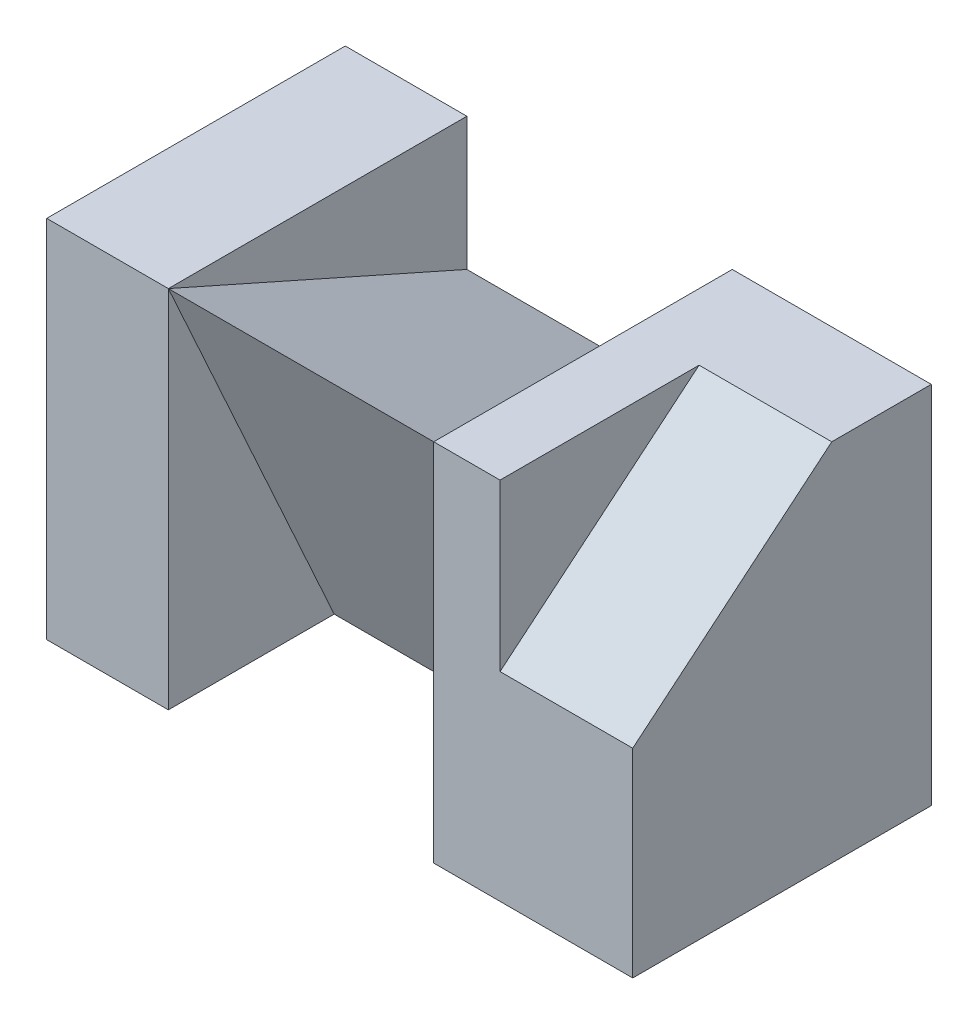
ISO-10303-21;
HEADER;
FILE_DESCRIPTION(('STEP AP214'),'2;1');
FILE_NAME('part.step','',(''),(''),'','','');
FILE_SCHEMA(('AUTOMOTIVE_DESIGN { 1 0 10303 214 1 1 1 1 }'));
ENDSEC;
DATA;
#1=APPLICATION_CONTEXT('core data for automotive mechanical design processes');
#2=APPLICATION_PROTOCOL_DEFINITION('international standard','automotive_design',2000,#1);
#3=PRODUCT_CONTEXT('',#1,'mechanical');
#4=PRODUCT('Part','Part','',(#3));
#5=PRODUCT_RELATED_PRODUCT_CATEGORY('part','',(#4));
#6=PRODUCT_DEFINITION_FORMATION('','',#4);
#7=PRODUCT_DEFINITION_CONTEXT('part definition',#1,'design');
#8=PRODUCT_DEFINITION('design','',#6,#7);
#9=PRODUCT_DEFINITION_SHAPE('','',#8);
#10=(LENGTH_UNIT() NAMED_UNIT(*) SI_UNIT(.MILLI.,.METRE.));
#11=(NAMED_UNIT(*) PLANE_ANGLE_UNIT() SI_UNIT($,.RADIAN.));
#12=(NAMED_UNIT(*) SI_UNIT($,.STERADIAN.) SOLID_ANGLE_UNIT());
#13=UNCERTAINTY_MEASURE_WITH_UNIT(LENGTH_MEASURE(1.E-05),#10,'distance_accuracy_value','');
#14=(GEOMETRIC_REPRESENTATION_CONTEXT(3) GLOBAL_UNCERTAINTY_ASSIGNED_CONTEXT((#13)) GLOBAL_UNIT_ASSIGNED_CONTEXT((#10,
#11,#12)) REPRESENTATION_CONTEXT('',''));
#15=CARTESIAN_POINT('',(0.,0.,0.));
#16=DIRECTION('',(0.,0.,1.));
#17=DIRECTION('',(1.,0.,0.));
#18=AXIS2_PLACEMENT_3D('',#15,#16,#17);
#19=CARTESIAN_POINT('',(0.,33.,-13.5));
#20=DIRECTION('',(0.,0.,-1.));
#21=DIRECTION('',(-1.,0.,0.));
#22=AXIS2_PLACEMENT_3D('',#19,#20,#21);
#23=PLANE('',#22);
#24=DIRECTION('',(1.,0.,0.));
#25=VECTOR('',#24,1.);
#26=CARTESIAN_POINT('',(0.,33.,-13.5));
#27=LINE('',#26,#25);
#28=CARTESIAN_POINT('',(-11.,33.,-13.5));
#29=VERTEX_POINT('',#28);
#30=CARTESIAN_POINT('',(0.,33.,-13.5));
#31=VERTEX_POINT('',#30);
#32=EDGE_CURVE('E179',#29,#31,#27,.T.);
#33=ORIENTED_EDGE('',*,*,#32,.T.);
#34=DIRECTION('',(0.,-1.,0.));
#35=VECTOR('',#34,1.);
#36=CARTESIAN_POINT('',(0.,33.,-13.5));
#37=LINE('',#36,#35);
#38=CARTESIAN_POINT('',(0.,21.,-13.5));
#39=VERTEX_POINT('',#38);
#40=EDGE_CURVE('E261',#31,#39,#37,.T.);
#41=ORIENTED_EDGE('',*,*,#40,.T.);
#42=DIRECTION('',(1.,0.,0.));
#43=VECTOR('',#42,1.);
#44=CARTESIAN_POINT('',(0.,21.,-13.5));
#45=LINE('',#44,#43);
#46=CARTESIAN_POINT('',(24.,21.,-13.5));
#47=VERTEX_POINT('',#46);
#48=EDGE_CURVE('E257',#39,#47,#45,.T.);
#49=ORIENTED_EDGE('',*,*,#48,.T.);
#50=DIRECTION('',(0.,-1.,0.));
#51=VECTOR('',#50,1.);
#52=CARTESIAN_POINT('',(24.,33.,-13.5));
#53=LINE('',#52,#51);
#54=CARTESIAN_POINT('',(24.,33.,-13.5));
#55=VERTEX_POINT('',#54);
#56=EDGE_CURVE('E253',#55,#47,#53,.T.);
#57=ORIENTED_EDGE('',*,*,#56,.F.);
#58=CARTESIAN_POINT('',(42.,33.,-13.5));
#59=VERTEX_POINT('',#58);
#60=EDGE_CURVE('E185',#55,#59,#27,.T.);
#61=ORIENTED_EDGE('',*,*,#60,.T.);
#62=DIRECTION('',(0.,-1.,0.));
#63=VECTOR('',#62,1.);
#64=CARTESIAN_POINT('',(42.,33.,-13.5));
#65=LINE('',#64,#63);
#66=CARTESIAN_POINT('',(42.,0.,-13.5));
#67=VERTEX_POINT('',#66);
#68=EDGE_CURVE('E12',#59,#67,#65,.T.);
#69=ORIENTED_EDGE('',*,*,#68,.T.);
#70=DIRECTION('',(1.,0.,0.));
#71=VECTOR('',#70,1.);
#72=CARTESIAN_POINT('',(0.,0.,-13.5));
#73=LINE('',#72,#71);
#74=CARTESIAN_POINT('',(-24.,0.,-13.5));
#75=VERTEX_POINT('',#74);
#76=EDGE_CURVE('E193',#75,#67,#73,.T.);
#77=ORIENTED_EDGE('',*,*,#76,.F.);
#78=DIRECTION('',(0.,-1.,0.));
#79=VECTOR('',#78,1.);
#80=CARTESIAN_POINT('',(-24.,13.,-13.5));
#81=LINE('',#80,#79);
#82=CARTESIAN_POINT('',(-24.,13.,-13.5));
#83=VERTEX_POINT('',#82);
#84=EDGE_CURVE('E222',#83,#75,#81,.T.);
#85=ORIENTED_EDGE('',*,*,#84,.F.);
#86=DIRECTION('',(1.,0.,0.));
#87=VECTOR('',#86,1.);
#88=CARTESIAN_POINT('',(0.,13.,-13.5));
#89=LINE('',#88,#87);
#90=CARTESIAN_POINT('',(-11.,13.,-13.5));
#91=VERTEX_POINT('',#90);
#92=EDGE_CURVE('E311',#83,#91,#89,.T.);
#93=ORIENTED_EDGE('',*,*,#92,.T.);
#94=DIRECTION('',(0.,-1.,0.));
#95=VECTOR('',#94,1.);
#96=CARTESIAN_POINT('',(-11.,33.,-13.5));
#97=LINE('',#96,#95);
#98=EDGE_CURVE('E194',#29,#91,#97,.T.);
#99=ORIENTED_EDGE('',*,*,#98,.F.);
#100=EDGE_LOOP('',(#33,#41,#49,#57,#61,#69,#77,#85,#93,#99));
#101=FACE_BOUND('',#100,.T.);
#102=ADVANCED_FACE('F62',(#101),#23,.T.);
#103=CARTESIAN_POINT('',(0.,33.,0.));
#104=DIRECTION('',(0.,1.,0.));
#105=DIRECTION('',(0.,0.,1.));
#106=AXIS2_PLACEMENT_3D('',#103,#104,#105);
#107=PLANE('',#106);
#108=DIRECTION('',(1.,0.,0.));
#109=VECTOR('',#108,1.);
#110=CARTESIAN_POINT('',(0.,33.,13.5));
#111=LINE('',#110,#109);
#112=CARTESIAN_POINT('',(-11.,33.,13.5));
#113=VERTEX_POINT('',#112);
#114=CARTESIAN_POINT('',(0.,33.,13.5));
#115=VERTEX_POINT('',#114);
#116=EDGE_CURVE('E178',#113,#115,#111,.T.);
#117=ORIENTED_EDGE('',*,*,#116,.T.);
#118=DIRECTION('',(0.,0.,-1.));
#119=VECTOR('',#118,1.);
#120=CARTESIAN_POINT('',(0.,33.,13.5));
#121=LINE('',#120,#119);
#122=EDGE_CURVE('E278',#115,#31,#121,.T.);
#123=ORIENTED_EDGE('',*,*,#122,.T.);
#124=ORIENTED_EDGE('',*,*,#32,.F.);
#125=DIRECTION('',(0.,0.,1.));
#126=VECTOR('',#125,1.);
#127=CARTESIAN_POINT('',(-11.,33.,0.));
#128=LINE('',#127,#126);
#129=EDGE_CURVE('E231',#29,#113,#128,.T.);
#130=ORIENTED_EDGE('',*,*,#129,.T.);
#131=EDGE_LOOP('',(#117,#123,#124,#130));
#132=FACE_BOUND('',#131,.T.);
#133=ADVANCED_FACE('F329',(#132),#107,.T.);
#134=CARTESIAN_POINT('',(0.,33.,13.5));
#135=DIRECTION('',(0.,0.,-1.));
#136=DIRECTION('',(-1.,0.,0.));
#137=AXIS2_PLACEMENT_3D('',#134,#135,#136);
#138=PLANE('',#137);
#139=DIRECTION('',(0.,-1.,0.));
#140=VECTOR('',#139,1.);
#141=CARTESIAN_POINT('',(42.,33.,13.5));
#142=LINE('',#141,#140);
#143=CARTESIAN_POINT('',(42.,18.,13.5));
#144=VERTEX_POINT('',#143);
#145=CARTESIAN_POINT('',(42.,0.,13.5));
#146=VERTEX_POINT('',#145);
#147=EDGE_CURVE('E71',#144,#146,#142,.T.);
#148=ORIENTED_EDGE('',*,*,#147,.F.);
#149=DIRECTION('',(1.,0.,0.));
#150=VECTOR('',#149,1.);
#151=CARTESIAN_POINT('',(30.,18.,13.5));
#152=LINE('',#151,#150);
#153=CARTESIAN_POINT('',(30.,18.,13.5));
#154=VERTEX_POINT('',#153);
#155=EDGE_CURVE('E170',#154,#144,#152,.T.);
#156=ORIENTED_EDGE('',*,*,#155,.F.);
#157=DIRECTION('',(0.,-1.,0.));
#158=VECTOR('',#157,1.);
#159=CARTESIAN_POINT('',(30.,18.,13.5));
#160=LINE('',#159,#158);
#161=CARTESIAN_POINT('',(30.,33.,13.5));
#162=VERTEX_POINT('',#161);
#163=EDGE_CURVE('E156',#162,#154,#160,.T.);
#164=ORIENTED_EDGE('',*,*,#163,.F.);
#165=CARTESIAN_POINT('',(24.,33.,13.5));
#166=VERTEX_POINT('',#165);
#167=EDGE_CURVE('E169',#166,#162,#111,.T.);
#168=ORIENTED_EDGE('',*,*,#167,.F.);
#169=DIRECTION('',(0.,1.,0.));
#170=VECTOR('',#169,1.);
#171=CARTESIAN_POINT('',(24.,0.,13.5));
#172=LINE('',#171,#170);
#173=CARTESIAN_POINT('',(24.,0.,13.5));
#174=VERTEX_POINT('',#173);
#175=EDGE_CURVE('E211',#174,#166,#172,.T.);
#176=ORIENTED_EDGE('',*,*,#175,.F.);
#177=DIRECTION('',(1.,0.,0.));
#178=VECTOR('',#177,1.);
#179=CARTESIAN_POINT('',(0.,0.,13.5));
#180=LINE('',#179,#178);
#181=EDGE_CURVE('E198',#174,#146,#180,.T.);
#182=ORIENTED_EDGE('',*,*,#181,.T.);
#183=EDGE_LOOP('',(#148,#156,#164,#168,#176,#182));
#184=FACE_BOUND('',#183,.T.);
#185=ADVANCED_FACE('F167',(#184),#138,.F.);
#186=CARTESIAN_POINT('',(42.,33.,0.));
#187=DIRECTION('',(1.,0.,0.));
#188=DIRECTION('',(0.,0.,-1.));
#189=AXIS2_PLACEMENT_3D('',#186,#187,#188);
#190=PLANE('',#189);
#191=DIRECTION('',(0.,0.64018439966448,-0.768221279597376));
#192=VECTOR('',#191,1.);
#193=CARTESIAN_POINT('',(42.,33.,-4.5));
#194=LINE('',#193,#192);
#195=CARTESIAN_POINT('',(42.,33.,-4.5));
#196=VERTEX_POINT('',#195);
#197=EDGE_CURVE('E161',#144,#196,#194,.T.);
#198=ORIENTED_EDGE('',*,*,#197,.F.);
#199=ORIENTED_EDGE('',*,*,#147,.T.);
#200=DIRECTION('',(0.,0.,1.));
#201=VECTOR('',#200,1.);
#202=CARTESIAN_POINT('',(42.,0.,0.));
#203=LINE('',#202,#201);
#204=EDGE_CURVE('E189',#67,#146,#203,.T.);
#205=ORIENTED_EDGE('',*,*,#204,.F.);
#206=ORIENTED_EDGE('',*,*,#68,.F.);
#207=DIRECTION('',(0.,0.,1.));
#208=VECTOR('',#207,1.);
#209=CARTESIAN_POINT('',(42.,33.,0.));
#210=LINE('',#209,#208);
#211=EDGE_CURVE('E202',#59,#196,#210,.T.);
#212=ORIENTED_EDGE('',*,*,#211,.T.);
#213=EDGE_LOOP('',(#198,#199,#205,#206,#212));
#214=FACE_BOUND('',#213,.T.);
#215=ADVANCED_FACE('F64',(#214),#190,.T.);
#216=CARTESIAN_POINT('',(-11.,0.,13.5));
#217=VERTEX_POINT('',#216);
#218=CARTESIAN_POINT('',(0.,0.,13.5));
#219=VERTEX_POINT('',#218);
#220=EDGE_CURVE('E199',#217,#219,#180,.T.);
#221=ORIENTED_EDGE('',*,*,#220,.T.);
#222=DIRECTION('',(0.,1.,0.));
#223=VECTOR('',#222,1.);
#224=CARTESIAN_POINT('',(0.,0.,13.5));
#225=LINE('',#224,#223);
#226=EDGE_CURVE('E290',#219,#115,#225,.T.);
#227=ORIENTED_EDGE('',*,*,#226,.T.);
#228=ORIENTED_EDGE('',*,*,#116,.F.);
#229=DIRECTION('',(0.,-1.,0.));
#230=VECTOR('',#229,1.);
#231=CARTESIAN_POINT('',(-11.,33.,13.5));
#232=LINE('',#231,#230);
#233=CARTESIAN_POINT('',(-11.,13.,13.5));
#234=VERTEX_POINT('',#233);
#235=EDGE_CURVE('E237',#113,#234,#232,.T.);
#236=ORIENTED_EDGE('',*,*,#235,.T.);
#237=DIRECTION('',(0.,-1.,0.));
#238=VECTOR('',#237,1.);
#239=CARTESIAN_POINT('',(-11.,13.,13.5));
#240=LINE('',#239,#238);
#241=EDGE_CURVE('E232',#234,#217,#240,.T.);
#242=ORIENTED_EDGE('',*,*,#241,.T.);
#243=EDGE_LOOP('',(#221,#227,#228,#236,#242));
#244=FACE_BOUND('',#243,.T.);
#245=ADVANCED_FACE('F327',(#244),#138,.F.);
#246=DIRECTION('',(1.,0.,0.));
#247=VECTOR('',#246,1.);
#248=CARTESIAN_POINT('',(30.,33.,-4.5));
#249=LINE('',#248,#247);
#250=CARTESIAN_POINT('',(30.,33.,-4.5));
#251=VERTEX_POINT('',#250);
#252=EDGE_CURVE('E254',#251,#196,#249,.T.);
#253=ORIENTED_EDGE('',*,*,#252,.T.);
#254=ORIENTED_EDGE('',*,*,#211,.F.);
#255=ORIENTED_EDGE('',*,*,#60,.F.);
#256=DIRECTION('',(0.,0.,-1.));
#257=VECTOR('',#256,1.);
#258=CARTESIAN_POINT('',(24.,33.,13.5));
#259=LINE('',#258,#257);
#260=EDGE_CURVE('E176',#166,#55,#259,.T.);
#261=ORIENTED_EDGE('',*,*,#260,.F.);
#262=ORIENTED_EDGE('',*,*,#167,.T.);
#263=DIRECTION('',(0.,0.,1.));
#264=VECTOR('',#263,1.);
#265=CARTESIAN_POINT('',(30.,33.,13.5));
#266=LINE('',#265,#264);
#267=EDGE_CURVE('E153',#251,#162,#266,.T.);
#268=ORIENTED_EDGE('',*,*,#267,.F.);
#269=EDGE_LOOP('',(#253,#254,#255,#261,#262,#268));
#270=FACE_BOUND('',#269,.T.);
#271=ADVANCED_FACE('F174',(#270),#107,.T.);
#272=CARTESIAN_POINT('',(0.,0.,0.));
#273=DIRECTION('',(0.,1.,0.));
#274=DIRECTION('',(0.,0.,1.));
#275=AXIS2_PLACEMENT_3D('',#272,#273,#274);
#276=PLANE('',#275);
#277=DIRECTION('',(1.,0.,0.));
#278=VECTOR('',#277,1.);
#279=CARTESIAN_POINT('',(0.,0.,-1.5));
#280=LINE('',#279,#278);
#281=CARTESIAN_POINT('',(0.,0.,-1.5));
#282=VERTEX_POINT('',#281);
#283=CARTESIAN_POINT('',(24.,0.,-1.5));
#284=VERTEX_POINT('',#283);
#285=EDGE_CURVE('E289',#282,#284,#280,.T.);
#286=ORIENTED_EDGE('',*,*,#285,.F.);
#287=DIRECTION('',(0.,0.,-1.));
#288=VECTOR('',#287,1.);
#289=CARTESIAN_POINT('',(0.,0.,13.5));
#290=LINE('',#289,#288);
#291=EDGE_CURVE('E299',#219,#282,#290,.T.);
#292=ORIENTED_EDGE('',*,*,#291,.F.);
#293=ORIENTED_EDGE('',*,*,#220,.F.);
#294=DIRECTION('',(-0.4338156187729,0.,-0.9010016697591));
#295=VECTOR('',#294,1.);
#296=CARTESIAN_POINT('',(-14.206570155902,0.,6.8402004454343));
#297=LINE('',#296,#295);
#298=EDGE_CURVE('E219',#217,#75,#297,.T.);
#299=ORIENTED_EDGE('',*,*,#298,.T.);
#300=ORIENTED_EDGE('',*,*,#76,.T.);
#301=ORIENTED_EDGE('',*,*,#204,.T.);
#302=ORIENTED_EDGE('',*,*,#181,.F.);
#303=DIRECTION('',(0.,0.,-1.));
#304=VECTOR('',#303,1.);
#305=CARTESIAN_POINT('',(24.,0.,13.5));
#306=LINE('',#305,#304);
#307=EDGE_CURVE('E295',#174,#284,#306,.T.);
#308=ORIENTED_EDGE('',*,*,#307,.T.);
#309=EDGE_LOOP('',(#286,#292,#293,#299,#300,#301,#302,#308));
#310=FACE_BOUND('',#309,.T.);
#311=ADVANCED_FACE('F216',(#310),#276,.F.);
#312=CARTESIAN_POINT('',(-11.,33.,0.));
#313=DIRECTION('',(1.,0.,0.));
#314=DIRECTION('',(0.,0.,-1.));
#315=AXIS2_PLACEMENT_3D('',#312,#313,#314);
#316=PLANE('',#315);
#317=ORIENTED_EDGE('',*,*,#98,.T.);
#318=DIRECTION('',(0.,0.,1.));
#319=VECTOR('',#318,1.);
#320=CARTESIAN_POINT('',(-11.,13.,0.));
#321=LINE('',#320,#319);
#322=EDGE_CURVE('E239',#91,#234,#321,.T.);
#323=ORIENTED_EDGE('',*,*,#322,.T.);
#324=ORIENTED_EDGE('',*,*,#235,.F.);
#325=ORIENTED_EDGE('',*,*,#129,.F.);
#326=EDGE_LOOP('',(#317,#323,#324,#325));
#327=FACE_BOUND('',#326,.T.);
#328=ADVANCED_FACE('F322',(#327),#316,.F.);
#329=CARTESIAN_POINT('',(-14.206570155902,13.,6.8402004454343));
#330=DIRECTION('',(-0.9010016697591,0.,0.4338156187729));
#331=DIRECTION('',(0.4338156187729,0.,0.9010016697591));
#332=AXIS2_PLACEMENT_3D('',#329,#330,#331);
#333=PLANE('',#332);
#334=ORIENTED_EDGE('',*,*,#298,.F.);
#335=ORIENTED_EDGE('',*,*,#241,.F.);
#336=DIRECTION('',(-0.4338156187729,0.,-0.9010016697591));
#337=VECTOR('',#336,1.);
#338=CARTESIAN_POINT('',(-14.206570155902,13.,6.8402004454343));
#339=LINE('',#338,#337);
#340=EDGE_CURVE('E229',#234,#83,#339,.T.);
#341=ORIENTED_EDGE('',*,*,#340,.T.);
#342=ORIENTED_EDGE('',*,*,#84,.T.);
#343=EDGE_LOOP('',(#334,#335,#341,#342));
#344=FACE_BOUND('',#343,.T.);
#345=ADVANCED_FACE('F226',(#344),#333,.T.);
#346=CARTESIAN_POINT('',(0.,13.,0.));
#347=DIRECTION('',(0.,1.,0.));
#348=DIRECTION('',(0.,0.,1.));
#349=AXIS2_PLACEMENT_3D('',#346,#347,#348);
#350=PLANE('',#349);
#351=ORIENTED_EDGE('',*,*,#92,.F.);
#352=ORIENTED_EDGE('',*,*,#340,.F.);
#353=ORIENTED_EDGE('',*,*,#322,.F.);
#354=EDGE_LOOP('',(#351,#352,#353));
#355=FACE_BOUND('',#354,.T.);
#356=ADVANCED_FACE('F330',(#355),#350,.T.);
#357=CARTESIAN_POINT('',(0.,0.,-1.5));
#358=DIRECTION('',(0.,0.413802944301184,-0.910366477462605));
#359=DIRECTION('',(0.,0.910366477462605,0.413802944301184));
#360=AXIS2_PLACEMENT_3D('',#357,#358,#359);
#361=PLANE('',#360);
#362=DIRECTION('',(0.,0.910366477462605,0.413802944301184));
#363=VECTOR('',#362,1.);
#364=CARTESIAN_POINT('',(24.,0.,-1.5));
#365=LINE('',#364,#363);
#366=EDGE_CURVE('E86',#284,#166,#365,.T.);
#367=ORIENTED_EDGE('',*,*,#366,.T.);
#368=DIRECTION('',(1.,0.,0.));
#369=VECTOR('',#368,1.);
#370=CARTESIAN_POINT('',(0.,33.,13.5));
#371=LINE('',#370,#369);
#372=EDGE_CURVE('E285',#115,#166,#371,.T.);
#373=ORIENTED_EDGE('',*,*,#372,.F.);
#374=DIRECTION('',(0.,0.910366477462605,0.413802944301184));
#375=VECTOR('',#374,1.);
#376=CARTESIAN_POINT('',(0.,0.,-1.5));
#377=LINE('',#376,#375);
#378=EDGE_CURVE('E294',#282,#115,#377,.T.);
#379=ORIENTED_EDGE('',*,*,#378,.F.);
#380=ORIENTED_EDGE('',*,*,#285,.T.);
#381=EDGE_LOOP('',(#367,#373,#379,#380));
#382=FACE_BOUND('',#381,.T.);
#383=ADVANCED_FACE('F332',(#382),#361,.F.);
#384=CARTESIAN_POINT('',(0.,0.,0.));
#385=DIRECTION('',(-1.,0.,0.));
#386=DIRECTION('',(0.,0.,1.));
#387=AXIS2_PLACEMENT_3D('',#384,#385,#386);
#388=PLANE('',#387);
#389=ORIENTED_EDGE('',*,*,#226,.F.);
#390=ORIENTED_EDGE('',*,*,#291,.T.);
#391=ORIENTED_EDGE('',*,*,#378,.T.);
#392=EDGE_LOOP('',(#389,#390,#391));
#393=FACE_BOUND('',#392,.T.);
#394=ADVANCED_FACE('F339',(#393),#388,.F.);
#395=CARTESIAN_POINT('',(24.,0.,0.));
#396=DIRECTION('',(-1.,0.,0.));
#397=DIRECTION('',(0.,0.,1.));
#398=AXIS2_PLACEMENT_3D('',#395,#396,#397);
#399=PLANE('',#398);
#400=ORIENTED_EDGE('',*,*,#175,.T.);
#401=ORIENTED_EDGE('',*,*,#366,.F.);
#402=ORIENTED_EDGE('',*,*,#307,.F.);
#403=EDGE_LOOP('',(#400,#401,#402));
#404=FACE_BOUND('',#403,.T.);
#405=ADVANCED_FACE('F334',(#404),#399,.T.);
#406=CARTESIAN_POINT('',(0.,21.,-13.5));
#407=DIRECTION('',(0.,0.913811548620257,-0.406138466053448));
#408=DIRECTION('',(0.,0.406138466053448,0.913811548620257));
#409=AXIS2_PLACEMENT_3D('',#406,#407,#408);
#410=PLANE('',#409);
#411=DIRECTION('',(0.,0.406138466053448,0.913811548620257));
#412=VECTOR('',#411,1.);
#413=CARTESIAN_POINT('',(24.,21.,-13.5));
#414=LINE('',#413,#412);
#415=EDGE_CURVE('E272',#47,#166,#414,.T.);
#416=ORIENTED_EDGE('',*,*,#415,.F.);
#417=ORIENTED_EDGE('',*,*,#48,.F.);
#418=DIRECTION('',(0.,0.406138466053448,0.913811548620257));
#419=VECTOR('',#418,1.);
#420=CARTESIAN_POINT('',(0.,21.,-13.5));
#421=LINE('',#420,#419);
#422=EDGE_CURVE('E269',#39,#115,#421,.T.);
#423=ORIENTED_EDGE('',*,*,#422,.T.);
#424=ORIENTED_EDGE('',*,*,#372,.T.);
#425=EDGE_LOOP('',(#416,#417,#423,#424));
#426=FACE_BOUND('',#425,.T.);
#427=ADVANCED_FACE('F342',(#426),#410,.T.);
#428=CARTESIAN_POINT('',(0.,0.,0.));
#429=DIRECTION('',(1.,0.,0.));
#430=DIRECTION('',(0.,0.,-1.));
#431=AXIS2_PLACEMENT_3D('',#428,#429,#430);
#432=PLANE('',#431);
#433=ORIENTED_EDGE('',*,*,#422,.F.);
#434=ORIENTED_EDGE('',*,*,#40,.F.);
#435=ORIENTED_EDGE('',*,*,#122,.F.);
#436=EDGE_LOOP('',(#433,#434,#435));
#437=FACE_BOUND('',#436,.T.);
#438=ADVANCED_FACE('F433',(#437),#432,.T.);
#439=CARTESIAN_POINT('',(24.,0.,0.));
#440=DIRECTION('',(1.,0.,0.));
#441=DIRECTION('',(0.,0.,-1.));
#442=AXIS2_PLACEMENT_3D('',#439,#440,#441);
#443=PLANE('',#442);
#444=ORIENTED_EDGE('',*,*,#415,.T.);
#445=ORIENTED_EDGE('',*,*,#260,.T.);
#446=ORIENTED_EDGE('',*,*,#56,.T.);
#447=EDGE_LOOP('',(#444,#445,#446));
#448=FACE_BOUND('',#447,.T.);
#449=ADVANCED_FACE('F444',(#448),#443,.F.);
#450=CARTESIAN_POINT('',(30.,33.,-4.5));
#451=DIRECTION('',(0.,-0.768221279597376,-0.64018439966448));
#452=DIRECTION('',(0.,0.64018439966448,-0.768221279597376));
#453=AXIS2_PLACEMENT_3D('',#450,#451,#452);
#454=PLANE('',#453);
#455=ORIENTED_EDGE('',*,*,#197,.T.);
#456=ORIENTED_EDGE('',*,*,#252,.F.);
#457=DIRECTION('',(0.,0.64018439966448,-0.768221279597376));
#458=VECTOR('',#457,1.);
#459=CARTESIAN_POINT('',(30.,33.,-4.5));
#460=LINE('',#459,#458);
#461=EDGE_CURVE('E78',#154,#251,#460,.T.);
#462=ORIENTED_EDGE('',*,*,#461,.F.);
#463=ORIENTED_EDGE('',*,*,#155,.T.);
#464=EDGE_LOOP('',(#455,#456,#462,#463));
#465=FACE_BOUND('',#464,.T.);
#466=ADVANCED_FACE('F455',(#465),#454,.F.);
#467=CARTESIAN_POINT('',(30.,0.,0.));
#468=DIRECTION('',(1.,0.,0.));
#469=DIRECTION('',(0.,0.,-1.));
#470=AXIS2_PLACEMENT_3D('',#467,#468,#469);
#471=PLANE('',#470);
#472=ORIENTED_EDGE('',*,*,#267,.T.);
#473=ORIENTED_EDGE('',*,*,#163,.T.);
#474=ORIENTED_EDGE('',*,*,#461,.T.);
#475=EDGE_LOOP('',(#472,#473,#474));
#476=FACE_BOUND('',#475,.T.);
#477=ADVANCED_FACE('F155',(#476),#471,.T.);
#478=CLOSED_SHELL('',(#102,#133,#185,#215,#245,#271,#311,#328,#345,#356,#383,#394,#405,#427,
#438,#449,#466,#477));
#479=MANIFOLD_SOLID_BREP('B2',#478);
#480=ADVANCED_BREP_SHAPE_REPRESENTATION('',(#18,#479),#14);
#481=SHAPE_DEFINITION_REPRESENTATION(#9,#480);
ENDSEC;
END-ISO-10303-21;
